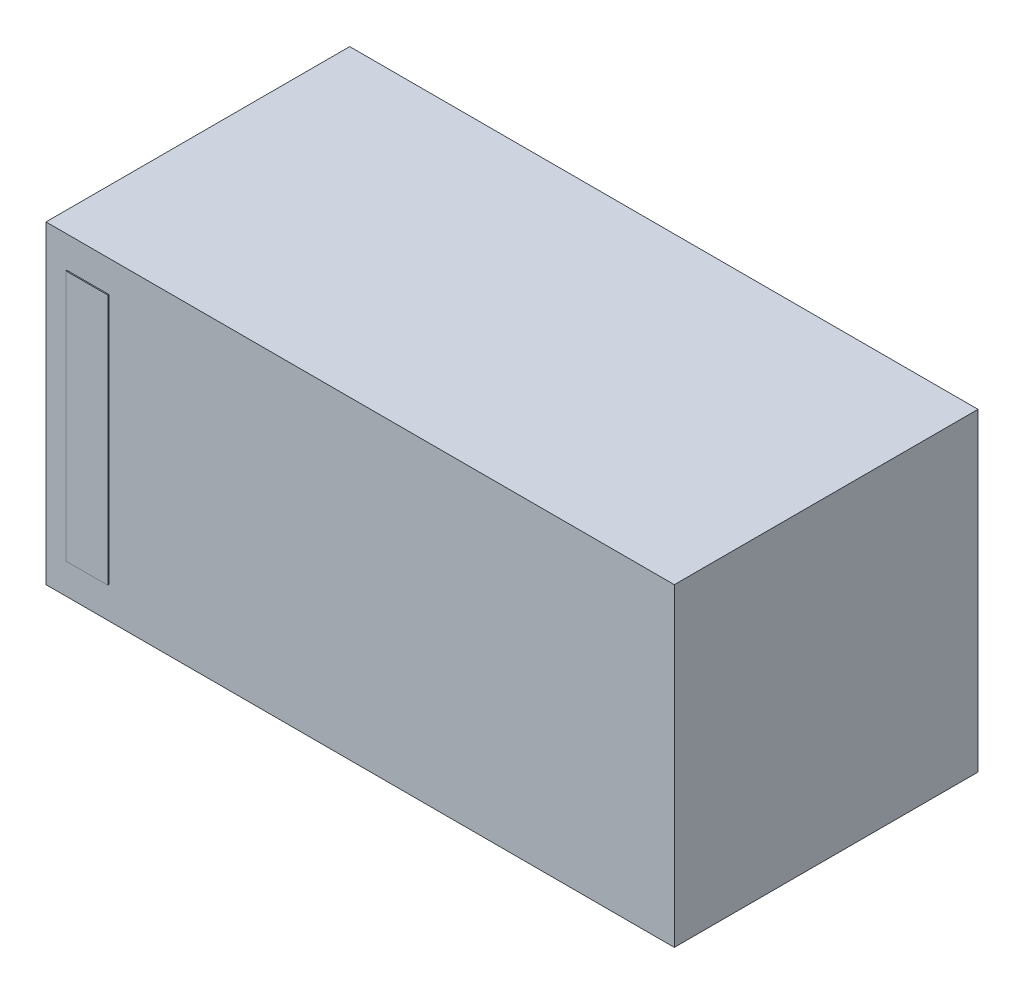
ISO-10303-21;
HEADER;
FILE_DESCRIPTION(('STEP AP214'),'2;1');
FILE_NAME('part.step','',(''),(''),'','','');
FILE_SCHEMA(('AUTOMOTIVE_DESIGN { 1 0 10303 214 1 1 1 1 }'));
ENDSEC;
DATA;
#1=APPLICATION_CONTEXT('core data for automotive mechanical design processes');
#2=APPLICATION_PROTOCOL_DEFINITION('international standard','automotive_design',2000,#1);
#3=PRODUCT_CONTEXT('',#1,'mechanical');
#4=PRODUCT('Part','Part','',(#3));
#5=PRODUCT_RELATED_PRODUCT_CATEGORY('part','',(#4));
#6=PRODUCT_DEFINITION_FORMATION('','',#4);
#7=PRODUCT_DEFINITION_CONTEXT('part definition',#1,'design');
#8=PRODUCT_DEFINITION('design','',#6,#7);
#9=PRODUCT_DEFINITION_SHAPE('','',#8);
#10=(LENGTH_UNIT() NAMED_UNIT(*) SI_UNIT(.MILLI.,.METRE.));
#11=(NAMED_UNIT(*) PLANE_ANGLE_UNIT() SI_UNIT($,.RADIAN.));
#12=(NAMED_UNIT(*) SI_UNIT($,.STERADIAN.) SOLID_ANGLE_UNIT());
#13=UNCERTAINTY_MEASURE_WITH_UNIT(LENGTH_MEASURE(1.E-05),#10,'distance_accuracy_value','');
#14=(GEOMETRIC_REPRESENTATION_CONTEXT(3) GLOBAL_UNCERTAINTY_ASSIGNED_CONTEXT((#13)) GLOBAL_UNIT_ASSIGNED_CONTEXT((#10,
#11,#12)) REPRESENTATION_CONTEXT('',''));
#15=CARTESIAN_POINT('',(0.,0.,0.));
#16=DIRECTION('',(0.,0.,1.));
#17=DIRECTION('',(1.,0.,0.));
#18=AXIS2_PLACEMENT_3D('',#15,#16,#17);
#19=CARTESIAN_POINT('',(-0.260000012349337,0.,0.32));
#20=DIRECTION('',(0.,0.,1.));
#21=DIRECTION('',(1.,0.,0.));
#22=AXIS2_PLACEMENT_3D('',#19,#20,#21);
#23=PLANE('',#22);
#24=DIRECTION('',(0.,1.,0.));
#25=VECTOR('',#24,1.);
#26=CARTESIAN_POINT('',(-0.280000013299286,0.120000005699694,0.32));
#27=LINE('',#26,#25);
#28=CARTESIAN_POINT('',(-0.280000013299286,0.120000005699694,0.32));
#29=VERTEX_POINT('',#28);
#30=CARTESIAN_POINT('',(-0.280000013299286,-0.120000005699694,0.32));
#31=VERTEX_POINT('',#30);
#32=EDGE_CURVE('P0_E84',#29,#31,#27,.F.);
#33=ORIENTED_EDGE('',*,*,#32,.F.);
#34=DIRECTION('',(1.,0.,0.));
#35=VECTOR('',#34,1.);
#36=CARTESIAN_POINT('',(-0.240000011399388,0.120000005699694,0.32));
#37=LINE('',#36,#35);
#38=CARTESIAN_POINT('',(-0.240000011399388,0.120000005699694,0.32));
#39=VERTEX_POINT('',#38);
#40=EDGE_CURVE('P0_E65',#39,#29,#37,.F.);
#41=ORIENTED_EDGE('',*,*,#40,.F.);
#42=DIRECTION('',(0.,1.,0.));
#43=VECTOR('',#42,1.);
#44=CARTESIAN_POINT('',(-0.240000011399388,-0.120000005699694,0.32));
#45=LINE('',#44,#43);
#46=CARTESIAN_POINT('',(-0.240000011399388,-0.120000005699694,0.32));
#47=VERTEX_POINT('',#46);
#48=EDGE_CURVE('P0_E66',#47,#39,#45,.T.);
#49=ORIENTED_EDGE('',*,*,#48,.F.);
#50=DIRECTION('',(1.,0.,0.));
#51=VECTOR('',#50,1.);
#52=CARTESIAN_POINT('',(-0.280000013299286,-0.120000005699694,0.32));
#53=LINE('',#52,#51);
#54=EDGE_CURVE('P0_E62',#31,#47,#53,.T.);
#55=ORIENTED_EDGE('',*,*,#54,.F.);
#56=EDGE_LOOP('',(#33,#41,#49,#55));
#57=FACE_BOUND('',#56,.T.);
#58=ADVANCED_FACE('P0_F17',(#57),#23,.F.);
#59=CARTESIAN_POINT('',(-0.280000013299286,-0.120000005699694,0.32));
#60=DIRECTION('',(0.,-1.,0.));
#61=DIRECTION('',(0.,0.,-1.));
#62=AXIS2_PLACEMENT_3D('',#59,#60,#61);
#63=PLANE('',#62);
#64=DIRECTION('',(1.,0.,0.));
#65=VECTOR('',#64,1.);
#66=CARTESIAN_POINT('',(-0.260000012349337,-0.120000005699694,0.321));
#67=LINE('',#66,#65);
#68=CARTESIAN_POINT('',(-0.280000013299286,-0.120000005699694,0.321));
#69=VERTEX_POINT('',#68);
#70=CARTESIAN_POINT('',(-0.240000011399388,-0.120000005699694,0.321));
#71=VERTEX_POINT('',#70);
#72=EDGE_CURVE('P0_E60',#69,#71,#67,.T.);
#73=ORIENTED_EDGE('',*,*,#72,.F.);
#74=DIRECTION('',(0.,0.,1.));
#75=VECTOR('',#74,1.);
#76=CARTESIAN_POINT('',(-0.280000013299286,-0.120000005699694,0.32));
#77=LINE('',#76,#75);
#78=EDGE_CURVE('P0_E77',#31,#69,#77,.T.);
#79=ORIENTED_EDGE('',*,*,#78,.F.);
#80=ORIENTED_EDGE('',*,*,#54,.T.);
#81=DIRECTION('',(0.,0.,-1.));
#82=VECTOR('',#81,1.);
#83=CARTESIAN_POINT('',(-0.240000011399388,-0.120000005699694,0.32));
#84=LINE('',#83,#82);
#85=EDGE_CURVE('P0_E20',#71,#47,#84,.T.);
#86=ORIENTED_EDGE('',*,*,#85,.F.);
#87=EDGE_LOOP('',(#73,#79,#80,#86));
#88=FACE_BOUND('',#87,.T.);
#89=ADVANCED_FACE('P0_F57',(#88),#63,.T.);
#90=CARTESIAN_POINT('',(-0.240000011399388,-0.120000005699694,0.32));
#91=DIRECTION('',(1.,0.,0.));
#92=DIRECTION('',(0.,0.,-1.));
#93=AXIS2_PLACEMENT_3D('',#90,#91,#92);
#94=PLANE('',#93);
#95=DIRECTION('',(0.,1.,0.));
#96=VECTOR('',#95,1.);
#97=CARTESIAN_POINT('',(-0.240000011399388,0.,0.321));
#98=LINE('',#97,#96);
#99=CARTESIAN_POINT('',(-0.240000011399388,0.120000005699694,0.321));
#100=VERTEX_POINT('',#99);
#101=EDGE_CURVE('P0_E68',#71,#100,#98,.T.);
#102=ORIENTED_EDGE('',*,*,#101,.F.);
#103=ORIENTED_EDGE('',*,*,#85,.T.);
#104=ORIENTED_EDGE('',*,*,#48,.T.);
#105=DIRECTION('',(0.,0.,1.));
#106=VECTOR('',#105,1.);
#107=CARTESIAN_POINT('',(-0.240000011399388,0.120000005699694,0.32));
#108=LINE('',#107,#106);
#109=EDGE_CURVE('P0_E71',#100,#39,#108,.F.);
#110=ORIENTED_EDGE('',*,*,#109,.F.);
#111=EDGE_LOOP('',(#102,#103,#104,#110));
#112=FACE_BOUND('',#111,.T.);
#113=ADVANCED_FACE('P0_F69',(#112),#94,.T.);
#114=CARTESIAN_POINT('',(-0.240000011399388,0.120000005699694,0.32));
#115=DIRECTION('',(0.,1.,0.));
#116=DIRECTION('',(0.,0.,1.));
#117=AXIS2_PLACEMENT_3D('',#114,#115,#116);
#118=PLANE('',#117);
#119=DIRECTION('',(1.,0.,0.));
#120=VECTOR('',#119,1.);
#121=CARTESIAN_POINT('',(-0.260000012349337,0.120000005699694,0.321));
#122=LINE('',#121,#120);
#123=CARTESIAN_POINT('',(-0.280000013299286,0.120000005699694,0.321));
#124=VERTEX_POINT('',#123);
#125=EDGE_CURVE('P0_E26',#100,#124,#122,.F.);
#126=ORIENTED_EDGE('',*,*,#125,.F.);
#127=ORIENTED_EDGE('',*,*,#109,.T.);
#128=ORIENTED_EDGE('',*,*,#40,.T.);
#129=DIRECTION('',(0.,0.,1.));
#130=VECTOR('',#129,1.);
#131=CARTESIAN_POINT('',(-0.280000013299286,0.120000005699694,0.32));
#132=LINE('',#131,#130);
#133=EDGE_CURVE('P0_E35',#124,#29,#132,.F.);
#134=ORIENTED_EDGE('',*,*,#133,.F.);
#135=EDGE_LOOP('',(#126,#127,#128,#134));
#136=FACE_BOUND('',#135,.T.);
#137=ADVANCED_FACE('P0_F88',(#136),#118,.T.);
#138=CARTESIAN_POINT('',(-0.280000013299286,0.120000005699694,0.32));
#139=DIRECTION('',(-1.,0.,0.));
#140=DIRECTION('',(0.,0.,1.));
#141=AXIS2_PLACEMENT_3D('',#138,#139,#140);
#142=PLANE('',#141);
#143=DIRECTION('',(0.,1.,0.));
#144=VECTOR('',#143,1.);
#145=CARTESIAN_POINT('',(-0.280000013299286,0.,0.321));
#146=LINE('',#145,#144);
#147=EDGE_CURVE('P0_E11',#124,#69,#146,.F.);
#148=ORIENTED_EDGE('',*,*,#147,.F.);
#149=ORIENTED_EDGE('',*,*,#133,.T.);
#150=ORIENTED_EDGE('',*,*,#32,.T.);
#151=ORIENTED_EDGE('',*,*,#78,.T.);
#152=EDGE_LOOP('',(#148,#149,#150,#151));
#153=FACE_BOUND('',#152,.T.);
#154=ADVANCED_FACE('P0_F90',(#153),#142,.T.);
#155=CARTESIAN_POINT('',(-0.260000012349337,0.,0.321));
#156=DIRECTION('',(0.,0.,1.));
#157=DIRECTION('',(1.,0.,0.));
#158=AXIS2_PLACEMENT_3D('',#155,#156,#157);
#159=PLANE('',#158);
#160=ORIENTED_EDGE('',*,*,#125,.T.);
#161=ORIENTED_EDGE('',*,*,#147,.T.);
#162=ORIENTED_EDGE('',*,*,#72,.T.);
#163=ORIENTED_EDGE('',*,*,#101,.T.);
#164=EDGE_LOOP('',(#160,#161,#162,#163));
#165=FACE_BOUND('',#164,.T.);
#166=ADVANCED_FACE('P0_F75',(#165),#159,.T.);
#167=CLOSED_SHELL('',(#58,#89,#113,#137,#154,#166));
#168=MANIFOLD_SOLID_BREP('P0_B1',#167);
#169=CARTESIAN_POINT('',(0.2,0.,0.));
#170=DIRECTION('',(0.,0.,1.));
#171=DIRECTION('',(1.,0.,0.));
#172=AXIS2_PLACEMENT_3D('',#169,#170,#171);
#173=PLANE('',#172);
#174=DIRECTION('',(0.,1.,0.));
#175=VECTOR('',#174,1.);
#176=CARTESIAN_POINT('',(0.13,0.12,0.));
#177=LINE('',#176,#175);
#178=CARTESIAN_POINT('',(0.13,0.12,0.));
#179=VERTEX_POINT('',#178);
#180=CARTESIAN_POINT('',(0.13,-0.12,0.));
#181=VERTEX_POINT('',#180);
#182=EDGE_CURVE('P1_E79',#179,#181,#177,.F.);
#183=ORIENTED_EDGE('',*,*,#182,.F.);
#184=DIRECTION('',(1.,0.,0.));
#185=VECTOR('',#184,1.);
#186=CARTESIAN_POINT('',(0.27,0.12,0.));
#187=LINE('',#186,#185);
#188=CARTESIAN_POINT('',(0.27,0.12,0.));
#189=VERTEX_POINT('',#188);
#190=EDGE_CURVE('P1_E55',#189,#179,#187,.F.);
#191=ORIENTED_EDGE('',*,*,#190,.F.);
#192=DIRECTION('',(0.,1.,0.));
#193=VECTOR('',#192,1.);
#194=CARTESIAN_POINT('',(0.27,-0.12,0.));
#195=LINE('',#194,#193);
#196=CARTESIAN_POINT('',(0.27,-0.12,0.));
#197=VERTEX_POINT('',#196);
#198=EDGE_CURVE('P1_E57',#197,#189,#195,.T.);
#199=ORIENTED_EDGE('',*,*,#198,.F.);
#200=DIRECTION('',(1.,0.,0.));
#201=VECTOR('',#200,1.);
#202=CARTESIAN_POINT('',(0.13,-0.12,0.));
#203=LINE('',#202,#201);
#204=EDGE_CURVE('P1_E20',#181,#197,#203,.T.);
#205=ORIENTED_EDGE('',*,*,#204,.F.);
#206=EDGE_LOOP('',(#183,#191,#199,#205));
#207=FACE_BOUND('',#206,.T.);
#208=ADVANCED_FACE('P1_F17',(#207),#173,.F.);
#209=CARTESIAN_POINT('',(0.13,-0.12,0.));
#210=DIRECTION('',(0.,-1.,0.));
#211=DIRECTION('',(0.,0.,-1.));
#212=AXIS2_PLACEMENT_3D('',#209,#210,#211);
#213=PLANE('',#212);
#214=DIRECTION('',(1.,0.,0.));
#215=VECTOR('',#214,1.);
#216=CARTESIAN_POINT('',(0.2,-0.12,0.03));
#217=LINE('',#216,#215);
#218=CARTESIAN_POINT('',(0.13,-0.12,0.03));
#219=VERTEX_POINT('',#218);
#220=CARTESIAN_POINT('',(0.27,-0.12,0.03));
#221=VERTEX_POINT('',#220);
#222=EDGE_CURVE('P1_E83',#219,#221,#217,.T.);
#223=ORIENTED_EDGE('',*,*,#222,.F.);
#224=DIRECTION('',(0.,0.,1.));
#225=VECTOR('',#224,1.);
#226=CARTESIAN_POINT('',(0.13,-0.12,0.));
#227=LINE('',#226,#225);
#228=EDGE_CURVE('P1_E68',#181,#219,#227,.T.);
#229=ORIENTED_EDGE('',*,*,#228,.F.);
#230=ORIENTED_EDGE('',*,*,#204,.T.);
#231=DIRECTION('',(0.,0.,-1.));
#232=VECTOR('',#231,1.);
#233=CARTESIAN_POINT('',(0.27,-0.12,0.));
#234=LINE('',#233,#232);
#235=EDGE_CURVE('P1_E63',#221,#197,#234,.T.);
#236=ORIENTED_EDGE('',*,*,#235,.F.);
#237=EDGE_LOOP('',(#223,#229,#230,#236));
#238=FACE_BOUND('',#237,.T.);
#239=ADVANCED_FACE('P1_F65',(#238),#213,.T.);
#240=CARTESIAN_POINT('',(0.27,-0.12,0.));
#241=DIRECTION('',(1.,0.,0.));
#242=DIRECTION('',(0.,0.,-1.));
#243=AXIS2_PLACEMENT_3D('',#240,#241,#242);
#244=PLANE('',#243);
#245=DIRECTION('',(0.,1.,0.));
#246=VECTOR('',#245,1.);
#247=CARTESIAN_POINT('',(0.27,0.,0.03));
#248=LINE('',#247,#246);
#249=CARTESIAN_POINT('',(0.27,0.12,0.03));
#250=VERTEX_POINT('',#249);
#251=EDGE_CURVE('P1_E72',#221,#250,#248,.T.);
#252=ORIENTED_EDGE('',*,*,#251,.F.);
#253=ORIENTED_EDGE('',*,*,#235,.T.);
#254=ORIENTED_EDGE('',*,*,#198,.T.);
#255=DIRECTION('',(0.,0.,1.));
#256=VECTOR('',#255,1.);
#257=CARTESIAN_POINT('',(0.27,0.12,0.));
#258=LINE('',#257,#256);
#259=EDGE_CURVE('P1_E75',#250,#189,#258,.F.);
#260=ORIENTED_EDGE('',*,*,#259,.F.);
#261=EDGE_LOOP('',(#252,#253,#254,#260));
#262=FACE_BOUND('',#261,.T.);
#263=ADVANCED_FACE('P1_F70',(#262),#244,.T.);
#264=CARTESIAN_POINT('',(0.27,0.12,0.));
#265=DIRECTION('',(0.,1.,0.));
#266=DIRECTION('',(0.,0.,1.));
#267=AXIS2_PLACEMENT_3D('',#264,#265,#266);
#268=PLANE('',#267);
#269=DIRECTION('',(1.,0.,0.));
#270=VECTOR('',#269,1.);
#271=CARTESIAN_POINT('',(0.2,0.12,0.03));
#272=LINE('',#271,#270);
#273=CARTESIAN_POINT('',(0.13,0.12,0.03));
#274=VERTEX_POINT('',#273);
#275=EDGE_CURVE('P1_E26',#250,#274,#272,.F.);
#276=ORIENTED_EDGE('',*,*,#275,.F.);
#277=ORIENTED_EDGE('',*,*,#259,.T.);
#278=ORIENTED_EDGE('',*,*,#190,.T.);
#279=DIRECTION('',(0.,0.,1.));
#280=VECTOR('',#279,1.);
#281=CARTESIAN_POINT('',(0.13,0.12,0.));
#282=LINE('',#281,#280);
#283=EDGE_CURVE('P1_E35',#274,#179,#282,.F.);
#284=ORIENTED_EDGE('',*,*,#283,.F.);
#285=EDGE_LOOP('',(#276,#277,#278,#284));
#286=FACE_BOUND('',#285,.T.);
#287=ADVANCED_FACE('P1_F89',(#286),#268,.T.);
#288=CARTESIAN_POINT('',(0.13,0.12,0.));
#289=DIRECTION('',(-1.,0.,0.));
#290=DIRECTION('',(0.,0.,1.));
#291=AXIS2_PLACEMENT_3D('',#288,#289,#290);
#292=PLANE('',#291);
#293=DIRECTION('',(0.,1.,0.));
#294=VECTOR('',#293,1.);
#295=CARTESIAN_POINT('',(0.13,0.,0.03));
#296=LINE('',#295,#294);
#297=EDGE_CURVE('P1_E11',#274,#219,#296,.F.);
#298=ORIENTED_EDGE('',*,*,#297,.F.);
#299=ORIENTED_EDGE('',*,*,#283,.T.);
#300=ORIENTED_EDGE('',*,*,#182,.T.);
#301=ORIENTED_EDGE('',*,*,#228,.T.);
#302=EDGE_LOOP('',(#298,#299,#300,#301));
#303=FACE_BOUND('',#302,.T.);
#304=ADVANCED_FACE('P1_F91',(#303),#292,.T.);
#305=CARTESIAN_POINT('',(0.2,0.,0.03));
#306=DIRECTION('',(0.,0.,1.));
#307=DIRECTION('',(1.,0.,0.));
#308=AXIS2_PLACEMENT_3D('',#305,#306,#307);
#309=PLANE('',#308);
#310=ORIENTED_EDGE('',*,*,#275,.T.);
#311=ORIENTED_EDGE('',*,*,#297,.T.);
#312=ORIENTED_EDGE('',*,*,#222,.T.);
#313=ORIENTED_EDGE('',*,*,#251,.T.);
#314=EDGE_LOOP('',(#310,#311,#312,#313));
#315=FACE_BOUND('',#314,.T.);
#316=ADVANCED_FACE('P1_F88',(#315),#309,.T.);
#317=CLOSED_SHELL('',(#208,#239,#263,#287,#304,#316));
#318=MANIFOLD_SOLID_BREP('P1_B1',#317);
#319=CARTESIAN_POINT('',(-0.2,0.,0.));
#320=DIRECTION('',(0.,0.,1.));
#321=DIRECTION('',(1.,0.,0.));
#322=AXIS2_PLACEMENT_3D('',#319,#320,#321);
#323=PLANE('',#322);
#324=DIRECTION('',(0.,1.,0.));
#325=VECTOR('',#324,1.);
#326=CARTESIAN_POINT('',(-0.27,0.12,0.));
#327=LINE('',#326,#325);
#328=CARTESIAN_POINT('',(-0.27,0.12,0.));
#329=VERTEX_POINT('',#328);
#330=CARTESIAN_POINT('',(-0.27,-0.12,0.));
#331=VERTEX_POINT('',#330);
#332=EDGE_CURVE('P2_E79',#329,#331,#327,.F.);
#333=ORIENTED_EDGE('',*,*,#332,.F.);
#334=DIRECTION('',(-1.,0.,0.));
#335=VECTOR('',#334,1.);
#336=CARTESIAN_POINT('',(-0.13,0.12,0.));
#337=LINE('',#336,#335);
#338=CARTESIAN_POINT('',(-0.13,0.12,0.));
#339=VERTEX_POINT('',#338);
#340=EDGE_CURVE('P2_E55',#339,#329,#337,.T.);
#341=ORIENTED_EDGE('',*,*,#340,.F.);
#342=DIRECTION('',(0.,1.,0.));
#343=VECTOR('',#342,1.);
#344=CARTESIAN_POINT('',(-0.13,-0.12,0.));
#345=LINE('',#344,#343);
#346=CARTESIAN_POINT('',(-0.13,-0.12,0.));
#347=VERTEX_POINT('',#346);
#348=EDGE_CURVE('P2_E57',#347,#339,#345,.T.);
#349=ORIENTED_EDGE('',*,*,#348,.F.);
#350=DIRECTION('',(1.,0.,0.));
#351=VECTOR('',#350,1.);
#352=CARTESIAN_POINT('',(-0.27,-0.12,0.));
#353=LINE('',#352,#351);
#354=EDGE_CURVE('P2_E20',#331,#347,#353,.T.);
#355=ORIENTED_EDGE('',*,*,#354,.F.);
#356=EDGE_LOOP('',(#333,#341,#349,#355));
#357=FACE_BOUND('',#356,.T.);
#358=ADVANCED_FACE('P2_F17',(#357),#323,.F.);
#359=CARTESIAN_POINT('',(-0.27,-0.12,0.));
#360=DIRECTION('',(0.,-1.,0.));
#361=DIRECTION('',(1.,0.,0.));
#362=AXIS2_PLACEMENT_3D('',#359,#360,#361);
#363=PLANE('',#362);
#364=DIRECTION('',(1.,0.,0.));
#365=VECTOR('',#364,1.);
#366=CARTESIAN_POINT('',(-0.2,-0.12,0.03));
#367=LINE('',#366,#365);
#368=CARTESIAN_POINT('',(-0.27,-0.12,0.03));
#369=VERTEX_POINT('',#368);
#370=CARTESIAN_POINT('',(-0.13,-0.12,0.03));
#371=VERTEX_POINT('',#370);
#372=EDGE_CURVE('P2_E83',#369,#371,#367,.T.);
#373=ORIENTED_EDGE('',*,*,#372,.F.);
#374=DIRECTION('',(0.,0.,1.));
#375=VECTOR('',#374,1.);
#376=CARTESIAN_POINT('',(-0.27,-0.12,0.));
#377=LINE('',#376,#375);
#378=EDGE_CURVE('P2_E68',#331,#369,#377,.T.);
#379=ORIENTED_EDGE('',*,*,#378,.F.);
#380=ORIENTED_EDGE('',*,*,#354,.T.);
#381=DIRECTION('',(0.,0.,1.));
#382=VECTOR('',#381,1.);
#383=CARTESIAN_POINT('',(-0.13,-0.12,0.));
#384=LINE('',#383,#382);
#385=EDGE_CURVE('P2_E63',#371,#347,#384,.F.);
#386=ORIENTED_EDGE('',*,*,#385,.F.);
#387=EDGE_LOOP('',(#373,#379,#380,#386));
#388=FACE_BOUND('',#387,.T.);
#389=ADVANCED_FACE('P2_F65',(#388),#363,.T.);
#390=CARTESIAN_POINT('',(-0.13,-0.12,0.));
#391=DIRECTION('',(1.,0.,0.));
#392=DIRECTION('',(0.,1.,0.));
#393=AXIS2_PLACEMENT_3D('',#390,#391,#392);
#394=PLANE('',#393);
#395=DIRECTION('',(0.,1.,0.));
#396=VECTOR('',#395,1.);
#397=CARTESIAN_POINT('',(-0.13,0.,0.03));
#398=LINE('',#397,#396);
#399=CARTESIAN_POINT('',(-0.13,0.12,0.03));
#400=VERTEX_POINT('',#399);
#401=EDGE_CURVE('P2_E72',#371,#400,#398,.T.);
#402=ORIENTED_EDGE('',*,*,#401,.F.);
#403=ORIENTED_EDGE('',*,*,#385,.T.);
#404=ORIENTED_EDGE('',*,*,#348,.T.);
#405=DIRECTION('',(0.,0.,1.));
#406=VECTOR('',#405,1.);
#407=CARTESIAN_POINT('',(-0.13,0.12,0.));
#408=LINE('',#407,#406);
#409=EDGE_CURVE('P2_E75',#400,#339,#408,.F.);
#410=ORIENTED_EDGE('',*,*,#409,.F.);
#411=EDGE_LOOP('',(#402,#403,#404,#410));
#412=FACE_BOUND('',#411,.T.);
#413=ADVANCED_FACE('P2_F70',(#412),#394,.T.);
#414=CARTESIAN_POINT('',(-0.13,0.12,0.));
#415=DIRECTION('',(0.,1.,0.));
#416=DIRECTION('',(-1.,0.,0.));
#417=AXIS2_PLACEMENT_3D('',#414,#415,#416);
#418=PLANE('',#417);
#419=DIRECTION('',(1.,0.,0.));
#420=VECTOR('',#419,1.);
#421=CARTESIAN_POINT('',(-0.2,0.12,0.03));
#422=LINE('',#421,#420);
#423=CARTESIAN_POINT('',(-0.27,0.12,0.03));
#424=VERTEX_POINT('',#423);
#425=EDGE_CURVE('P2_E26',#400,#424,#422,.F.);
#426=ORIENTED_EDGE('',*,*,#425,.F.);
#427=ORIENTED_EDGE('',*,*,#409,.T.);
#428=ORIENTED_EDGE('',*,*,#340,.T.);
#429=DIRECTION('',(0.,0.,1.));
#430=VECTOR('',#429,1.);
#431=CARTESIAN_POINT('',(-0.27,0.12,0.));
#432=LINE('',#431,#430);
#433=EDGE_CURVE('P2_E35',#424,#329,#432,.F.);
#434=ORIENTED_EDGE('',*,*,#433,.F.);
#435=EDGE_LOOP('',(#426,#427,#428,#434));
#436=FACE_BOUND('',#435,.T.);
#437=ADVANCED_FACE('P2_F89',(#436),#418,.T.);
#438=CARTESIAN_POINT('',(-0.27,0.12,0.));
#439=DIRECTION('',(-1.,0.,0.));
#440=DIRECTION('',(0.,0.,1.));
#441=AXIS2_PLACEMENT_3D('',#438,#439,#440);
#442=PLANE('',#441);
#443=DIRECTION('',(0.,1.,0.));
#444=VECTOR('',#443,1.);
#445=CARTESIAN_POINT('',(-0.27,0.,0.03));
#446=LINE('',#445,#444);
#447=EDGE_CURVE('P2_E11',#424,#369,#446,.F.);
#448=ORIENTED_EDGE('',*,*,#447,.F.);
#449=ORIENTED_EDGE('',*,*,#433,.T.);
#450=ORIENTED_EDGE('',*,*,#332,.T.);
#451=ORIENTED_EDGE('',*,*,#378,.T.);
#452=EDGE_LOOP('',(#448,#449,#450,#451));
#453=FACE_BOUND('',#452,.T.);
#454=ADVANCED_FACE('P2_F91',(#453),#442,.T.);
#455=CARTESIAN_POINT('',(-0.2,0.,0.03));
#456=DIRECTION('',(0.,0.,1.));
#457=DIRECTION('',(1.,0.,0.));
#458=AXIS2_PLACEMENT_3D('',#455,#456,#457);
#459=PLANE('',#458);
#460=ORIENTED_EDGE('',*,*,#425,.T.);
#461=ORIENTED_EDGE('',*,*,#447,.T.);
#462=ORIENTED_EDGE('',*,*,#372,.T.);
#463=ORIENTED_EDGE('',*,*,#401,.T.);
#464=EDGE_LOOP('',(#460,#461,#462,#463));
#465=FACE_BOUND('',#464,.T.);
#466=ADVANCED_FACE('P2_F88',(#465),#459,.T.);
#467=CLOSED_SHELL('',(#358,#389,#413,#437,#454,#466));
#468=MANIFOLD_SOLID_BREP('P2_B1',#467);
#469=CARTESIAN_POINT('',(0.,0.,0.03));
#470=DIRECTION('',(0.,0.,1.));
#471=DIRECTION('',(1.,0.,0.));
#472=AXIS2_PLACEMENT_3D('',#469,#470,#471);
#473=PLANE('',#472);
#474=DIRECTION('',(1.,0.,0.));
#475=VECTOR('',#474,1.);
#476=CARTESIAN_POINT('',(0.3,0.15,0.03));
#477=LINE('',#476,#475);
#478=CARTESIAN_POINT('',(0.3,0.15,0.03));
#479=VERTEX_POINT('',#478);
#480=CARTESIAN_POINT('',(-0.3,0.15,0.03));
#481=VERTEX_POINT('',#480);
#482=EDGE_CURVE('P3_E79',#479,#481,#477,.F.);
#483=ORIENTED_EDGE('',*,*,#482,.F.);
#484=DIRECTION('',(0.,1.,0.));
#485=VECTOR('',#484,1.);
#486=CARTESIAN_POINT('',(0.3,-0.15,0.03));
#487=LINE('',#486,#485);
#488=CARTESIAN_POINT('',(0.3,-0.15,0.03));
#489=VERTEX_POINT('',#488);
#490=EDGE_CURVE('P3_E55',#489,#479,#487,.T.);
#491=ORIENTED_EDGE('',*,*,#490,.F.);
#492=DIRECTION('',(1.,0.,0.));
#493=VECTOR('',#492,1.);
#494=CARTESIAN_POINT('',(-0.3,-0.15,0.03));
#495=LINE('',#494,#493);
#496=CARTESIAN_POINT('',(-0.3,-0.15,0.03));
#497=VERTEX_POINT('',#496);
#498=EDGE_CURVE('P3_E57',#497,#489,#495,.T.);
#499=ORIENTED_EDGE('',*,*,#498,.F.);
#500=DIRECTION('',(0.,1.,0.));
#501=VECTOR('',#500,1.);
#502=CARTESIAN_POINT('',(-0.3,0.15,0.03));
#503=LINE('',#502,#501);
#504=EDGE_CURVE('P3_E20',#481,#497,#503,.F.);
#505=ORIENTED_EDGE('',*,*,#504,.F.);
#506=EDGE_LOOP('',(#483,#491,#499,#505));
#507=FACE_BOUND('',#506,.T.);
#508=ADVANCED_FACE('P3_F17',(#507),#473,.F.);
#509=CARTESIAN_POINT('',(-0.3,0.15,0.03));
#510=DIRECTION('',(-1.,0.,0.));
#511=DIRECTION('',(0.,0.,1.));
#512=AXIS2_PLACEMENT_3D('',#509,#510,#511);
#513=PLANE('',#512);
#514=DIRECTION('',(0.,1.,0.));
#515=VECTOR('',#514,1.);
#516=CARTESIAN_POINT('',(-0.3,0.,0.32));
#517=LINE('',#516,#515);
#518=CARTESIAN_POINT('',(-0.3,0.15,0.32));
#519=VERTEX_POINT('',#518);
#520=CARTESIAN_POINT('',(-0.3,-0.15,0.32));
#521=VERTEX_POINT('',#520);
#522=EDGE_CURVE('P3_E83',#519,#521,#517,.F.);
#523=ORIENTED_EDGE('',*,*,#522,.F.);
#524=DIRECTION('',(0.,0.,1.));
#525=VECTOR('',#524,1.);
#526=CARTESIAN_POINT('',(-0.3,0.15,0.03));
#527=LINE('',#526,#525);
#528=EDGE_CURVE('P3_E68',#481,#519,#527,.T.);
#529=ORIENTED_EDGE('',*,*,#528,.F.);
#530=ORIENTED_EDGE('',*,*,#504,.T.);
#531=DIRECTION('',(0.,0.,-1.));
#532=VECTOR('',#531,1.);
#533=CARTESIAN_POINT('',(-0.3,-0.15,0.03));
#534=LINE('',#533,#532);
#535=EDGE_CURVE('P3_E63',#521,#497,#534,.T.);
#536=ORIENTED_EDGE('',*,*,#535,.F.);
#537=EDGE_LOOP('',(#523,#529,#530,#536));
#538=FACE_BOUND('',#537,.T.);
#539=ADVANCED_FACE('P3_F65',(#538),#513,.T.);
#540=CARTESIAN_POINT('',(-0.3,-0.15,0.03));
#541=DIRECTION('',(0.,-1.,0.));
#542=DIRECTION('',(0.,0.,-1.));
#543=AXIS2_PLACEMENT_3D('',#540,#541,#542);
#544=PLANE('',#543);
#545=DIRECTION('',(1.,0.,0.));
#546=VECTOR('',#545,1.);
#547=CARTESIAN_POINT('',(0.,-0.15,0.32));
#548=LINE('',#547,#546);
#549=CARTESIAN_POINT('',(0.3,-0.15,0.32));
#550=VERTEX_POINT('',#549);
#551=EDGE_CURVE('P3_E72',#521,#550,#548,.T.);
#552=ORIENTED_EDGE('',*,*,#551,.F.);
#553=ORIENTED_EDGE('',*,*,#535,.T.);
#554=ORIENTED_EDGE('',*,*,#498,.T.);
#555=DIRECTION('',(0.,0.,-1.));
#556=VECTOR('',#555,1.);
#557=CARTESIAN_POINT('',(0.3,-0.15,0.03));
#558=LINE('',#557,#556);
#559=EDGE_CURVE('P3_E75',#550,#489,#558,.T.);
#560=ORIENTED_EDGE('',*,*,#559,.F.);
#561=EDGE_LOOP('',(#552,#553,#554,#560));
#562=FACE_BOUND('',#561,.T.);
#563=ADVANCED_FACE('P3_F70',(#562),#544,.T.);
#564=CARTESIAN_POINT('',(0.3,-0.15,0.03));
#565=DIRECTION('',(1.,0.,0.));
#566=DIRECTION('',(0.,0.,-1.));
#567=AXIS2_PLACEMENT_3D('',#564,#565,#566);
#568=PLANE('',#567);
#569=DIRECTION('',(0.,1.,0.));
#570=VECTOR('',#569,1.);
#571=CARTESIAN_POINT('',(0.3,0.,0.32));
#572=LINE('',#571,#570);
#573=CARTESIAN_POINT('',(0.3,0.15,0.32));
#574=VERTEX_POINT('',#573);
#575=EDGE_CURVE('P3_E26',#550,#574,#572,.T.);
#576=ORIENTED_EDGE('',*,*,#575,.F.);
#577=ORIENTED_EDGE('',*,*,#559,.T.);
#578=ORIENTED_EDGE('',*,*,#490,.T.);
#579=DIRECTION('',(0.,0.,1.));
#580=VECTOR('',#579,1.);
#581=CARTESIAN_POINT('',(0.3,0.15,0.03));
#582=LINE('',#581,#580);
#583=EDGE_CURVE('P3_E35',#574,#479,#582,.F.);
#584=ORIENTED_EDGE('',*,*,#583,.F.);
#585=EDGE_LOOP('',(#576,#577,#578,#584));
#586=FACE_BOUND('',#585,.T.);
#587=ADVANCED_FACE('P3_F89',(#586),#568,.T.);
#588=CARTESIAN_POINT('',(0.3,0.15,0.03));
#589=DIRECTION('',(0.,1.,0.));
#590=DIRECTION('',(0.,0.,1.));
#591=AXIS2_PLACEMENT_3D('',#588,#589,#590);
#592=PLANE('',#591);
#593=DIRECTION('',(1.,0.,0.));
#594=VECTOR('',#593,1.);
#595=CARTESIAN_POINT('',(0.,0.15,0.32));
#596=LINE('',#595,#594);
#597=EDGE_CURVE('P3_E11',#574,#519,#596,.F.);
#598=ORIENTED_EDGE('',*,*,#597,.F.);
#599=ORIENTED_EDGE('',*,*,#583,.T.);
#600=ORIENTED_EDGE('',*,*,#482,.T.);
#601=ORIENTED_EDGE('',*,*,#528,.T.);
#602=EDGE_LOOP('',(#598,#599,#600,#601));
#603=FACE_BOUND('',#602,.T.);
#604=ADVANCED_FACE('P3_F91',(#603),#592,.T.);
#605=CARTESIAN_POINT('',(0.,0.,0.32));
#606=DIRECTION('',(0.,0.,1.));
#607=DIRECTION('',(1.,0.,0.));
#608=AXIS2_PLACEMENT_3D('',#605,#606,#607);
#609=PLANE('',#608);
#610=ORIENTED_EDGE('',*,*,#575,.T.);
#611=ORIENTED_EDGE('',*,*,#597,.T.);
#612=ORIENTED_EDGE('',*,*,#522,.T.);
#613=ORIENTED_EDGE('',*,*,#551,.T.);
#614=EDGE_LOOP('',(#610,#611,#612,#613));
#615=FACE_BOUND('',#614,.T.);
#616=ADVANCED_FACE('P3_F88',(#615),#609,.T.);
#617=CLOSED_SHELL('',(#508,#539,#563,#587,#604,#616));
#618=MANIFOLD_SOLID_BREP('P3_B1',#617);
#619=ADVANCED_BREP_SHAPE_REPRESENTATION('',(#18,#168,#318,#468,#618),#14);
#620=SHAPE_DEFINITION_REPRESENTATION(#9,#619);
ENDSEC;
END-ISO-10303-21;
